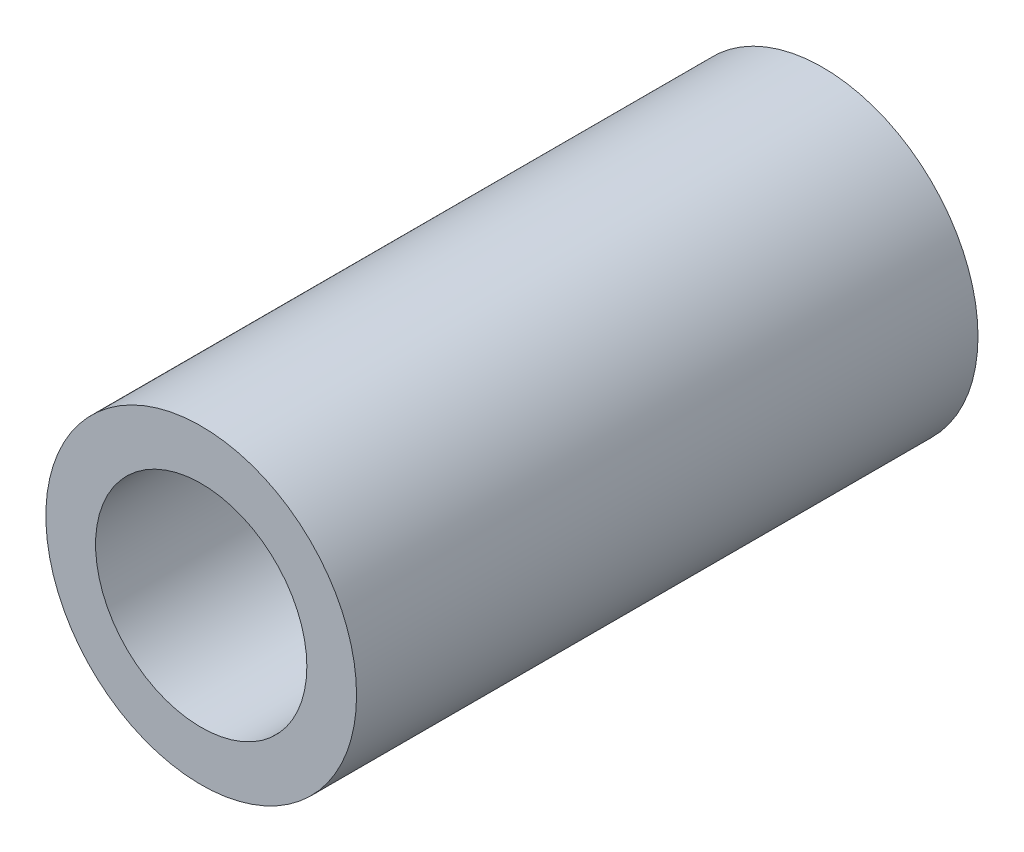
ISO-10303-21;
HEADER;
FILE_DESCRIPTION(('STEP AP214'),'2;1');
FILE_NAME('part.step','',(''),(''),'','','');
FILE_SCHEMA(('AUTOMOTIVE_DESIGN { 1 0 10303 214 1 1 1 1 }'));
ENDSEC;
DATA;
#1=APPLICATION_CONTEXT('core data for automotive mechanical design processes');
#2=APPLICATION_PROTOCOL_DEFINITION('international standard','automotive_design',2000,#1);
#3=PRODUCT_CONTEXT('',#1,'mechanical');
#4=PRODUCT('Part','Part','',(#3));
#5=PRODUCT_RELATED_PRODUCT_CATEGORY('part','',(#4));
#6=PRODUCT_DEFINITION_FORMATION('','',#4);
#7=PRODUCT_DEFINITION_CONTEXT('part definition',#1,'design');
#8=PRODUCT_DEFINITION('design','',#6,#7);
#9=PRODUCT_DEFINITION_SHAPE('','',#8);
#10=(LENGTH_UNIT() NAMED_UNIT(*) SI_UNIT(.MILLI.,.METRE.));
#11=(NAMED_UNIT(*) PLANE_ANGLE_UNIT() SI_UNIT($,.RADIAN.));
#12=(NAMED_UNIT(*) SI_UNIT($,.STERADIAN.) SOLID_ANGLE_UNIT());
#13=UNCERTAINTY_MEASURE_WITH_UNIT(LENGTH_MEASURE(1.E-05),#10,'distance_accuracy_value','');
#14=(GEOMETRIC_REPRESENTATION_CONTEXT(3) GLOBAL_UNCERTAINTY_ASSIGNED_CONTEXT((#13)) GLOBAL_UNIT_ASSIGNED_CONTEXT((#10,
#11,#12)) REPRESENTATION_CONTEXT('',''));
#15=CARTESIAN_POINT('',(0.,0.,0.));
#16=DIRECTION('',(0.,0.,1.));
#17=DIRECTION('',(1.,0.,0.));
#18=AXIS2_PLACEMENT_3D('',#15,#16,#17);
#19=CARTESIAN_POINT('',(0.,0.,-25.));
#20=DIRECTION('',(0.,0.,1.));
#21=DIRECTION('',(1.,0.,0.));
#22=AXIS2_PLACEMENT_3D('',#19,#20,#21);
#23=CYLINDRICAL_SURFACE('',#22,12.5);
#24=CARTESIAN_POINT('',(0.,0.,-25.));
#25=DIRECTION('',(0.,0.,1.));
#26=DIRECTION('',(1.,0.,0.));
#27=AXIS2_PLACEMENT_3D('',#24,#25,#26);
#28=CIRCLE('',#27,12.5);
#29=CARTESIAN_POINT('',(12.5,0.,-25.));
#30=VERTEX_POINT('',#29);
#31=EDGE_CURVE('E10',#30,#30,#28,.T.);
#32=ORIENTED_EDGE('',*,*,#31,.T.);
#33=EDGE_LOOP('',(#32));
#34=FACE_BOUND('',#33,.T.);
#35=CARTESIAN_POINT('',(0.,0.,25.));
#36=DIRECTION('',(0.,0.,1.));
#37=DIRECTION('',(1.,0.,0.));
#38=AXIS2_PLACEMENT_3D('',#35,#36,#37);
#39=CIRCLE('',#38,12.5);
#40=CARTESIAN_POINT('',(12.5,0.,25.));
#41=VERTEX_POINT('',#40);
#42=EDGE_CURVE('E43',#41,#41,#39,.T.);
#43=ORIENTED_EDGE('',*,*,#42,.F.);
#44=EDGE_LOOP('',(#43));
#45=FACE_BOUND('',#44,.T.);
#46=ADVANCED_FACE('F37',(#34,#45),#23,.T.);
#47=CARTESIAN_POINT('',(0.,0.,-25.));
#48=DIRECTION('',(0.,0.,1.));
#49=DIRECTION('',(1.,0.,0.));
#50=AXIS2_PLACEMENT_3D('',#47,#48,#49);
#51=PLANE('',#50);
#52=CARTESIAN_POINT('',(0.,0.,-25.));
#53=DIRECTION('',(0.,0.,1.));
#54=DIRECTION('',(1.,0.,0.));
#55=AXIS2_PLACEMENT_3D('',#52,#53,#54);
#56=CIRCLE('',#55,8.5);
#57=CARTESIAN_POINT('',(8.5,0.,-25.));
#58=VERTEX_POINT('',#57);
#59=EDGE_CURVE('E47',#58,#58,#56,.T.);
#60=ORIENTED_EDGE('',*,*,#59,.T.);
#61=EDGE_LOOP('',(#60));
#62=FACE_BOUND('',#61,.T.);
#63=ORIENTED_EDGE('',*,*,#31,.F.);
#64=EDGE_LOOP('',(#63));
#65=FACE_BOUND('',#64,.T.);
#66=ADVANCED_FACE('F61',(#62,#65),#51,.F.);
#67=CARTESIAN_POINT('',(0.,0.,25.));
#68=DIRECTION('',(0.,0.,1.));
#69=DIRECTION('',(1.,0.,0.));
#70=AXIS2_PLACEMENT_3D('',#67,#68,#69);
#71=PLANE('',#70);
#72=CARTESIAN_POINT('',(0.,0.,25.));
#73=DIRECTION('',(0.,0.,1.));
#74=DIRECTION('',(1.,0.,0.));
#75=AXIS2_PLACEMENT_3D('',#72,#73,#74);
#76=CIRCLE('',#75,8.5);
#77=CARTESIAN_POINT('',(8.5,0.,25.));
#78=VERTEX_POINT('',#77);
#79=EDGE_CURVE('E51',#78,#78,#76,.T.);
#80=ORIENTED_EDGE('',*,*,#79,.F.);
#81=EDGE_LOOP('',(#80));
#82=FACE_BOUND('',#81,.T.);
#83=ORIENTED_EDGE('',*,*,#42,.T.);
#84=EDGE_LOOP('',(#83));
#85=FACE_BOUND('',#84,.T.);
#86=ADVANCED_FACE('F59',(#82,#85),#71,.T.);
#87=CARTESIAN_POINT('',(0.,0.,-25.));
#88=DIRECTION('',(0.,0.,1.));
#89=DIRECTION('',(1.,0.,0.));
#90=AXIS2_PLACEMENT_3D('',#87,#88,#89);
#91=CYLINDRICAL_SURFACE('',#90,8.5);
#92=ORIENTED_EDGE('',*,*,#59,.F.);
#93=EDGE_LOOP('',(#92));
#94=FACE_BOUND('',#93,.T.);
#95=ORIENTED_EDGE('',*,*,#79,.T.);
#96=EDGE_LOOP('',(#95));
#97=FACE_BOUND('',#96,.T.);
#98=ADVANCED_FACE('F57',(#94,#97),#91,.F.);
#99=CLOSED_SHELL('',(#46,#66,#86,#98));
#100=MANIFOLD_SOLID_BREP('B2',#99);
#101=ADVANCED_BREP_SHAPE_REPRESENTATION('',(#18,#100),#14);
#102=SHAPE_DEFINITION_REPRESENTATION(#9,#101);
ENDSEC;
END-ISO-10303-21;
